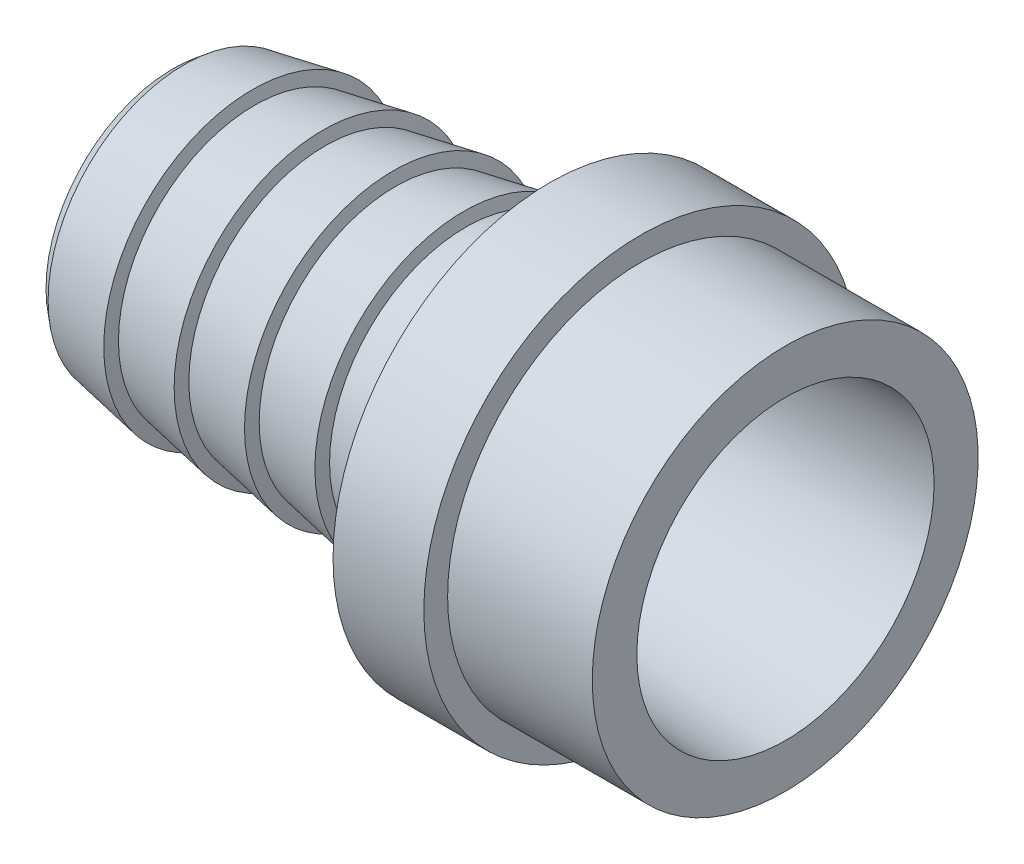
ISO-10303-21;
HEADER;
FILE_DESCRIPTION(('STEP AP214'),'2;1');
FILE_NAME('part.step','',(''),(''),'','','');
FILE_SCHEMA(('AUTOMOTIVE_DESIGN { 1 0 10303 214 1 1 1 1 }'));
ENDSEC;
DATA;
#1=APPLICATION_CONTEXT('core data for automotive mechanical design processes');
#2=APPLICATION_PROTOCOL_DEFINITION('international standard','automotive_design',2000,#1);
#3=PRODUCT_CONTEXT('',#1,'mechanical');
#4=PRODUCT('Part','Part','',(#3));
#5=PRODUCT_RELATED_PRODUCT_CATEGORY('part','',(#4));
#6=PRODUCT_DEFINITION_FORMATION('','',#4);
#7=PRODUCT_DEFINITION_CONTEXT('part definition',#1,'design');
#8=PRODUCT_DEFINITION('design','',#6,#7);
#9=PRODUCT_DEFINITION_SHAPE('','',#8);
#10=(LENGTH_UNIT() NAMED_UNIT(*) SI_UNIT(.MILLI.,.METRE.));
#11=(NAMED_UNIT(*) PLANE_ANGLE_UNIT() SI_UNIT($,.RADIAN.));
#12=(NAMED_UNIT(*) SI_UNIT($,.STERADIAN.) SOLID_ANGLE_UNIT());
#13=UNCERTAINTY_MEASURE_WITH_UNIT(LENGTH_MEASURE(1.E-05),#10,'distance_accuracy_value','');
#14=(GEOMETRIC_REPRESENTATION_CONTEXT(3) GLOBAL_UNCERTAINTY_ASSIGNED_CONTEXT((#13)) GLOBAL_UNIT_ASSIGNED_CONTEXT((#10,
#11,#12)) REPRESENTATION_CONTEXT('',''));
#15=CARTESIAN_POINT('',(0.,0.,0.));
#16=DIRECTION('',(0.,0.,1.));
#17=DIRECTION('',(1.,0.,0.));
#18=AXIS2_PLACEMENT_3D('',#15,#16,#17);
#19=CARTESIAN_POINT('',(0.,0.,0.));
#20=DIRECTION('',(1.,0.,0.));
#21=DIRECTION('',(0.,0.,-1.));
#22=AXIS2_PLACEMENT_3D('',#19,#20,#21);
#23=CONICAL_SURFACE('',#22,10.0954124925542,0.0555324503143095);
#24=CARTESIAN_POINT('',(53.9675106125926,0.,0.));
#25=DIRECTION('',(-1.,0.,0.));
#26=DIRECTION('',(0.,0.,1.));
#27=AXIS2_PLACEMENT_3D('',#24,#25,#26);
#28=CIRCLE('',#27,13.0954451150103);
#29=CARTESIAN_POINT('',(53.9675106125926,0.,13.0954451150103));
#30=VERTEX_POINT('',#29);
#31=EDGE_CURVE('E10',#30,#30,#28,.T.);
#32=ORIENTED_EDGE('',*,*,#31,.F.);
#33=EDGE_LOOP('',(#32));
#34=FACE_BOUND('',#33,.T.);
#35=CARTESIAN_POINT('',(0.,0.,0.));
#36=DIRECTION('',(-1.,0.,0.));
#37=DIRECTION('',(0.,0.,1.));
#38=AXIS2_PLACEMENT_3D('',#35,#36,#37);
#39=CIRCLE('',#38,10.0954124925542);
#40=CARTESIAN_POINT('',(0.,0.,10.0954124925542));
#41=VERTEX_POINT('',#40);
#42=EDGE_CURVE('E95',#41,#41,#39,.T.);
#43=ORIENTED_EDGE('',*,*,#42,.T.);
#44=EDGE_LOOP('',(#43));
#45=FACE_BOUND('',#44,.T.);
#46=ADVANCED_FACE('F37',(#34,#45),#23,.F.);
#47=CARTESIAN_POINT('',(53.9675106125926,0.,0.));
#48=DIRECTION('',(-1.,0.,0.));
#49=DIRECTION('',(0.,0.,1.));
#50=AXIS2_PLACEMENT_3D('',#47,#48,#49);
#51=CONICAL_SURFACE('',#50,13.0954451150103,1.56472855215344);
#52=CARTESIAN_POINT('',(53.9438183627084,0.,0.));
#53=DIRECTION('',(-1.,0.,0.));
#54=DIRECTION('',(0.,0.,1.));
#55=AXIS2_PLACEMENT_3D('',#52,#53,#54);
#56=CIRCLE('',#55,17.);
#57=CARTESIAN_POINT('',(53.9438183627084,0.,17.));
#58=VERTEX_POINT('',#57);
#59=EDGE_CURVE('E43',#58,#58,#56,.T.);
#60=ORIENTED_EDGE('',*,*,#59,.F.);
#61=EDGE_LOOP('',(#60));
#62=FACE_BOUND('',#61,.T.);
#63=ORIENTED_EDGE('',*,*,#31,.T.);
#64=EDGE_LOOP('',(#63));
#65=FACE_BOUND('',#64,.T.);
#66=ADVANCED_FACE('F192',(#62,#65),#51,.T.);
#67=CARTESIAN_POINT('',(0.,0.,0.));
#68=DIRECTION('',(-1.,0.,0.));
#69=DIRECTION('',(0.,0.,1.));
#70=AXIS2_PLACEMENT_3D('',#67,#68,#69);
#71=CYLINDRICAL_SURFACE('',#70,17.);
#72=CARTESIAN_POINT('',(41.2,0.,0.));
#73=DIRECTION('',(-1.,0.,0.));
#74=DIRECTION('',(0.,0.,1.));
#75=AXIS2_PLACEMENT_3D('',#72,#73,#74);
#76=CIRCLE('',#75,17.);
#77=CARTESIAN_POINT('',(41.2,0.,17.));
#78=VERTEX_POINT('',#77);
#79=EDGE_CURVE('E47',#78,#78,#76,.T.);
#80=ORIENTED_EDGE('',*,*,#79,.F.);
#81=EDGE_LOOP('',(#80));
#82=FACE_BOUND('',#81,.T.);
#83=ORIENTED_EDGE('',*,*,#59,.T.);
#84=EDGE_LOOP('',(#83));
#85=FACE_BOUND('',#84,.T.);
#86=ADVANCED_FACE('F187',(#82,#85),#71,.T.);
#87=CARTESIAN_POINT('',(41.2,0.,-19.0954451150103));
#88=DIRECTION('',(-1.,0.,0.));
#89=DIRECTION('',(0.,0.,1.));
#90=AXIS2_PLACEMENT_3D('',#87,#88,#89);
#91=PLANE('',#90);
#92=CARTESIAN_POINT('',(41.2,0.,0.));
#93=DIRECTION('',(-1.,0.,0.));
#94=DIRECTION('',(0.,0.,1.));
#95=AXIS2_PLACEMENT_3D('',#92,#93,#94);
#96=CIRCLE('',#95,19.0954451150103);
#97=CARTESIAN_POINT('',(41.2,0.,19.0954451150103));
#98=VERTEX_POINT('',#97);
#99=EDGE_CURVE('E51',#98,#98,#96,.T.);
#100=ORIENTED_EDGE('',*,*,#99,.F.);
#101=EDGE_LOOP('',(#100));
#102=FACE_BOUND('',#101,.T.);
#103=ORIENTED_EDGE('',*,*,#79,.T.);
#104=EDGE_LOOP('',(#103));
#105=FACE_BOUND('',#104,.T.);
#106=ADVANCED_FACE('F181',(#102,#105),#91,.F.);
#107=CARTESIAN_POINT('',(0.,0.,0.));
#108=DIRECTION('',(-1.,0.,0.));
#109=DIRECTION('',(0.,0.,1.));
#110=AXIS2_PLACEMENT_3D('',#107,#108,#109);
#111=CYLINDRICAL_SURFACE('',#110,19.0954451150103);
#112=CARTESIAN_POINT('',(33.2,0.,0.));
#113=DIRECTION('',(-1.,0.,0.));
#114=DIRECTION('',(0.,0.,1.));
#115=AXIS2_PLACEMENT_3D('',#112,#113,#114);
#116=CIRCLE('',#115,19.0954451150103);
#117=CARTESIAN_POINT('',(33.2,0.,19.0954451150103));
#118=VERTEX_POINT('',#117);
#119=EDGE_CURVE('E56',#118,#118,#116,.T.);
#120=ORIENTED_EDGE('',*,*,#119,.F.);
#121=EDGE_LOOP('',(#120));
#122=FACE_BOUND('',#121,.T.);
#123=ORIENTED_EDGE('',*,*,#99,.T.);
#124=EDGE_LOOP('',(#123));
#125=FACE_BOUND('',#124,.T.);
#126=ADVANCED_FACE('F175',(#122,#125),#111,.T.);
#127=CARTESIAN_POINT('',(33.2,0.,-13.0954451150103));
#128=DIRECTION('',(1.,0.,0.));
#129=DIRECTION('',(0.,0.,-1.));
#130=AXIS2_PLACEMENT_3D('',#127,#128,#129);
#131=PLANE('',#130);
#132=CARTESIAN_POINT('',(33.2,0.,0.));
#133=DIRECTION('',(-1.,0.,0.));
#134=DIRECTION('',(0.,0.,1.));
#135=AXIS2_PLACEMENT_3D('',#132,#133,#134);
#136=CIRCLE('',#135,13.0954451150103);
#137=CARTESIAN_POINT('',(33.2,0.,13.0954451150103));
#138=VERTEX_POINT('',#137);
#139=EDGE_CURVE('E59',#138,#138,#136,.T.);
#140=ORIENTED_EDGE('',*,*,#139,.F.);
#141=EDGE_LOOP('',(#140));
#142=FACE_BOUND('',#141,.T.);
#143=ORIENTED_EDGE('',*,*,#119,.T.);
#144=EDGE_LOOP('',(#143));
#145=FACE_BOUND('',#144,.T.);
#146=ADVANCED_FACE('F169',(#142,#145),#131,.F.);
#147=CARTESIAN_POINT('',(0.,0.,0.));
#148=DIRECTION('',(-1.,0.,0.));
#149=DIRECTION('',(0.,0.,1.));
#150=AXIS2_PLACEMENT_3D('',#147,#148,#149);
#151=CYLINDRICAL_SURFACE('',#150,13.0954451150103);
#152=CARTESIAN_POINT('',(31.8,0.,0.));
#153=DIRECTION('',(-1.,0.,0.));
#154=DIRECTION('',(0.,0.,1.));
#155=AXIS2_PLACEMENT_3D('',#152,#153,#154);
#156=CIRCLE('',#155,13.0954451150103);
#157=CARTESIAN_POINT('',(31.8,0.,13.0954451150103));
#158=VERTEX_POINT('',#157);
#159=EDGE_CURVE('E62',#158,#158,#156,.T.);
#160=ORIENTED_EDGE('',*,*,#159,.F.);
#161=EDGE_LOOP('',(#160));
#162=FACE_BOUND('',#161,.T.);
#163=ORIENTED_EDGE('',*,*,#139,.T.);
#164=EDGE_LOOP('',(#163));
#165=FACE_BOUND('',#164,.T.);
#166=ADVANCED_FACE('F163',(#162,#165),#151,.T.);
#167=CARTESIAN_POINT('',(31.8,0.,0.));
#168=DIRECTION('',(1.,0.,0.));
#169=DIRECTION('',(0.,0.,-1.));
#170=AXIS2_PLACEMENT_3D('',#167,#168,#169);
#171=CONICAL_SURFACE('',#170,13.0954451150103,0.180585214190698);
#172=CARTESIAN_POINT('',(25.8,0.,0.));
#173=DIRECTION('',(-1.,0.,0.));
#174=DIRECTION('',(0.,0.,1.));
#175=AXIS2_PLACEMENT_3D('',#172,#173,#174);
#176=CIRCLE('',#175,12.);
#177=CARTESIAN_POINT('',(25.8,0.,12.));
#178=VERTEX_POINT('',#177);
#179=EDGE_CURVE('E65',#178,#178,#176,.T.);
#180=ORIENTED_EDGE('',*,*,#179,.F.);
#181=EDGE_LOOP('',(#180));
#182=FACE_BOUND('',#181,.T.);
#183=ORIENTED_EDGE('',*,*,#159,.T.);
#184=EDGE_LOOP('',(#183));
#185=FACE_BOUND('',#184,.T.);
#186=ADVANCED_FACE('F157',(#182,#185),#171,.T.);
#187=CARTESIAN_POINT('',(25.8,0.,0.));
#188=DIRECTION('',(-1.,0.,0.));
#189=DIRECTION('',(0.,0.,1.));
#190=AXIS2_PLACEMENT_3D('',#187,#188,#189);
#191=CONICAL_SURFACE('',#190,12.,1.39021111260421);
#192=CARTESIAN_POINT('',(25.6,0.,0.));
#193=DIRECTION('',(-1.,0.,0.));
#194=DIRECTION('',(0.,0.,1.));
#195=AXIS2_PLACEMENT_3D('',#192,#193,#194);
#196=CIRCLE('',#195,13.0954451150103);
#197=CARTESIAN_POINT('',(25.6,0.,13.0954451150103));
#198=VERTEX_POINT('',#197);
#199=EDGE_CURVE('E68',#198,#198,#196,.T.);
#200=ORIENTED_EDGE('',*,*,#199,.F.);
#201=EDGE_LOOP('',(#200));
#202=FACE_BOUND('',#201,.T.);
#203=ORIENTED_EDGE('',*,*,#179,.T.);
#204=EDGE_LOOP('',(#203));
#205=FACE_BOUND('',#204,.T.);
#206=ADVANCED_FACE('F151',(#202,#205),#191,.T.);
#207=CARTESIAN_POINT('',(25.6,0.,0.));
#208=DIRECTION('',(1.,0.,0.));
#209=DIRECTION('',(0.,0.,-1.));
#210=AXIS2_PLACEMENT_3D('',#207,#208,#209);
#211=CONICAL_SURFACE('',#210,13.0954451150103,0.180585214190698);
#212=CARTESIAN_POINT('',(19.6,0.,0.));
#213=DIRECTION('',(-1.,0.,0.));
#214=DIRECTION('',(0.,0.,1.));
#215=AXIS2_PLACEMENT_3D('',#212,#213,#214);
#216=CIRCLE('',#215,12.);
#217=CARTESIAN_POINT('',(19.6,0.,12.));
#218=VERTEX_POINT('',#217);
#219=EDGE_CURVE('E71',#218,#218,#216,.T.);
#220=ORIENTED_EDGE('',*,*,#219,.F.);
#221=EDGE_LOOP('',(#220));
#222=FACE_BOUND('',#221,.T.);
#223=ORIENTED_EDGE('',*,*,#199,.T.);
#224=EDGE_LOOP('',(#223));
#225=FACE_BOUND('',#224,.T.);
#226=ADVANCED_FACE('F145',(#222,#225),#211,.T.);
#227=CARTESIAN_POINT('',(19.6,0.,0.));
#228=DIRECTION('',(-1.,0.,0.));
#229=DIRECTION('',(0.,0.,1.));
#230=AXIS2_PLACEMENT_3D('',#227,#228,#229);
#231=CONICAL_SURFACE('',#230,12.,1.39021111260421);
#232=CARTESIAN_POINT('',(19.4,0.,0.));
#233=DIRECTION('',(-1.,0.,0.));
#234=DIRECTION('',(0.,0.,1.));
#235=AXIS2_PLACEMENT_3D('',#232,#233,#234);
#236=CIRCLE('',#235,13.0954451150103);
#237=CARTESIAN_POINT('',(19.4,0.,13.0954451150103));
#238=VERTEX_POINT('',#237);
#239=EDGE_CURVE('E74',#238,#238,#236,.T.);
#240=ORIENTED_EDGE('',*,*,#239,.F.);
#241=EDGE_LOOP('',(#240));
#242=FACE_BOUND('',#241,.T.);
#243=ORIENTED_EDGE('',*,*,#219,.T.);
#244=EDGE_LOOP('',(#243));
#245=FACE_BOUND('',#244,.T.);
#246=ADVANCED_FACE('F139',(#242,#245),#231,.T.);
#247=CARTESIAN_POINT('',(19.4,0.,0.));
#248=DIRECTION('',(1.,0.,0.));
#249=DIRECTION('',(0.,0.,-1.));
#250=AXIS2_PLACEMENT_3D('',#247,#248,#249);
#251=CONICAL_SURFACE('',#250,13.0954451150103,0.180585214190698);
#252=CARTESIAN_POINT('',(13.4,0.,0.));
#253=DIRECTION('',(-1.,0.,0.));
#254=DIRECTION('',(0.,0.,1.));
#255=AXIS2_PLACEMENT_3D('',#252,#253,#254);
#256=CIRCLE('',#255,12.);
#257=CARTESIAN_POINT('',(13.4,0.,12.));
#258=VERTEX_POINT('',#257);
#259=EDGE_CURVE('E77',#258,#258,#256,.T.);
#260=ORIENTED_EDGE('',*,*,#259,.F.);
#261=EDGE_LOOP('',(#260));
#262=FACE_BOUND('',#261,.T.);
#263=ORIENTED_EDGE('',*,*,#239,.T.);
#264=EDGE_LOOP('',(#263));
#265=FACE_BOUND('',#264,.T.);
#266=ADVANCED_FACE('F133',(#262,#265),#251,.T.);
#267=CARTESIAN_POINT('',(13.4,0.,0.));
#268=DIRECTION('',(-1.,0.,0.));
#269=DIRECTION('',(0.,0.,1.));
#270=AXIS2_PLACEMENT_3D('',#267,#268,#269);
#271=CONICAL_SURFACE('',#270,12.,1.39021111260421);
#272=CARTESIAN_POINT('',(13.2,0.,0.));
#273=DIRECTION('',(-1.,0.,0.));
#274=DIRECTION('',(0.,0.,1.));
#275=AXIS2_PLACEMENT_3D('',#272,#273,#274);
#276=CIRCLE('',#275,13.0954451150103);
#277=CARTESIAN_POINT('',(13.2,0.,13.0954451150103));
#278=VERTEX_POINT('',#277);
#279=EDGE_CURVE('E80',#278,#278,#276,.T.);
#280=ORIENTED_EDGE('',*,*,#279,.F.);
#281=EDGE_LOOP('',(#280));
#282=FACE_BOUND('',#281,.T.);
#283=ORIENTED_EDGE('',*,*,#259,.T.);
#284=EDGE_LOOP('',(#283));
#285=FACE_BOUND('',#284,.T.);
#286=ADVANCED_FACE('F127',(#282,#285),#271,.T.);
#287=CARTESIAN_POINT('',(13.2,0.,0.));
#288=DIRECTION('',(1.,0.,0.));
#289=DIRECTION('',(0.,0.,-1.));
#290=AXIS2_PLACEMENT_3D('',#287,#288,#289);
#291=CONICAL_SURFACE('',#290,13.0954451150103,0.180585214190698);
#292=CARTESIAN_POINT('',(7.2,0.,0.));
#293=DIRECTION('',(-1.,0.,0.));
#294=DIRECTION('',(0.,0.,1.));
#295=AXIS2_PLACEMENT_3D('',#292,#293,#294);
#296=CIRCLE('',#295,12.);
#297=CARTESIAN_POINT('',(7.2,0.,12.));
#298=VERTEX_POINT('',#297);
#299=EDGE_CURVE('E83',#298,#298,#296,.T.);
#300=ORIENTED_EDGE('',*,*,#299,.F.);
#301=EDGE_LOOP('',(#300));
#302=FACE_BOUND('',#301,.T.);
#303=ORIENTED_EDGE('',*,*,#279,.T.);
#304=EDGE_LOOP('',(#303));
#305=FACE_BOUND('',#304,.T.);
#306=ADVANCED_FACE('F121',(#302,#305),#291,.T.);
#307=CARTESIAN_POINT('',(7.2,0.,0.));
#308=DIRECTION('',(-1.,0.,0.));
#309=DIRECTION('',(0.,0.,1.));
#310=AXIS2_PLACEMENT_3D('',#307,#308,#309);
#311=CONICAL_SURFACE('',#310,12.,1.3902111126042);
#312=CARTESIAN_POINT('',(7.,0.,0.));
#313=DIRECTION('',(-1.,0.,0.));
#314=DIRECTION('',(0.,0.,1.));
#315=AXIS2_PLACEMENT_3D('',#312,#313,#314);
#316=CIRCLE('',#315,13.0954451150103);
#317=CARTESIAN_POINT('',(7.,0.,13.0954451150103));
#318=VERTEX_POINT('',#317);
#319=EDGE_CURVE('E86',#318,#318,#316,.T.);
#320=ORIENTED_EDGE('',*,*,#319,.F.);
#321=EDGE_LOOP('',(#320));
#322=FACE_BOUND('',#321,.T.);
#323=ORIENTED_EDGE('',*,*,#299,.T.);
#324=EDGE_LOOP('',(#323));
#325=FACE_BOUND('',#324,.T.);
#326=ADVANCED_FACE('F115',(#322,#325),#311,.T.);
#327=CARTESIAN_POINT('',(7.,0.,0.));
#328=DIRECTION('',(1.,0.,0.));
#329=DIRECTION('',(0.,0.,-1.));
#330=AXIS2_PLACEMENT_3D('',#327,#328,#329);
#331=CONICAL_SURFACE('',#330,13.0954451150103,0.180585214190698);
#332=CARTESIAN_POINT('',(1.,0.,0.));
#333=DIRECTION('',(-1.,0.,0.));
#334=DIRECTION('',(0.,0.,1.));
#335=AXIS2_PLACEMENT_3D('',#332,#333,#334);
#336=CIRCLE('',#335,12.);
#337=CARTESIAN_POINT('',(1.,0.,12.));
#338=VERTEX_POINT('',#337);
#339=EDGE_CURVE('E89',#338,#338,#336,.T.);
#340=ORIENTED_EDGE('',*,*,#339,.F.);
#341=EDGE_LOOP('',(#340));
#342=FACE_BOUND('',#341,.T.);
#343=ORIENTED_EDGE('',*,*,#319,.T.);
#344=EDGE_LOOP('',(#343));
#345=FACE_BOUND('',#344,.T.);
#346=ADVANCED_FACE('F109',(#342,#345),#331,.T.);
#347=CARTESIAN_POINT('',(1.,0.,0.));
#348=DIRECTION('',(1.,0.,0.));
#349=DIRECTION('',(0.,0.,-1.));
#350=AXIS2_PLACEMENT_3D('',#347,#348,#349);
#351=CONICAL_SURFACE('',#350,12.,0.684651816137485);
#352=CARTESIAN_POINT('',(0.,0.,0.));
#353=DIRECTION('',(-1.,0.,0.));
#354=DIRECTION('',(0.,0.,1.));
#355=AXIS2_PLACEMENT_3D('',#352,#353,#354);
#356=CIRCLE('',#355,11.1836157243346);
#357=CARTESIAN_POINT('',(0.,0.,11.1836157243346));
#358=VERTEX_POINT('',#357);
#359=EDGE_CURVE('E92',#358,#358,#356,.T.);
#360=ORIENTED_EDGE('',*,*,#359,.F.);
#361=EDGE_LOOP('',(#360));
#362=FACE_BOUND('',#361,.T.);
#363=ORIENTED_EDGE('',*,*,#339,.T.);
#364=EDGE_LOOP('',(#363));
#365=FACE_BOUND('',#364,.T.);
#366=ADVANCED_FACE('F103',(#362,#365),#351,.T.);
#367=CARTESIAN_POINT('',(0.,0.,-10.0954124925542));
#368=DIRECTION('',(1.,0.,0.));
#369=DIRECTION('',(0.,0.,-1.));
#370=AXIS2_PLACEMENT_3D('',#367,#368,#369);
#371=PLANE('',#370);
#372=ORIENTED_EDGE('',*,*,#42,.F.);
#373=EDGE_LOOP('',(#372));
#374=FACE_BOUND('',#373,.T.);
#375=ORIENTED_EDGE('',*,*,#359,.T.);
#376=EDGE_LOOP('',(#375));
#377=FACE_BOUND('',#376,.T.);
#378=ADVANCED_FACE('F100',(#374,#377),#371,.F.);
#379=CLOSED_SHELL('',(#46,#66,#86,#106,#126,#146,#166,#186,#206,#226,#246,#266,#286,#306,#326,
#346,#366,#378));
#380=MANIFOLD_SOLID_BREP('B2',#379);
#381=ADVANCED_BREP_SHAPE_REPRESENTATION('',(#18,#380),#14);
#382=SHAPE_DEFINITION_REPRESENTATION(#9,#381);
ENDSEC;
END-ISO-10303-21;
